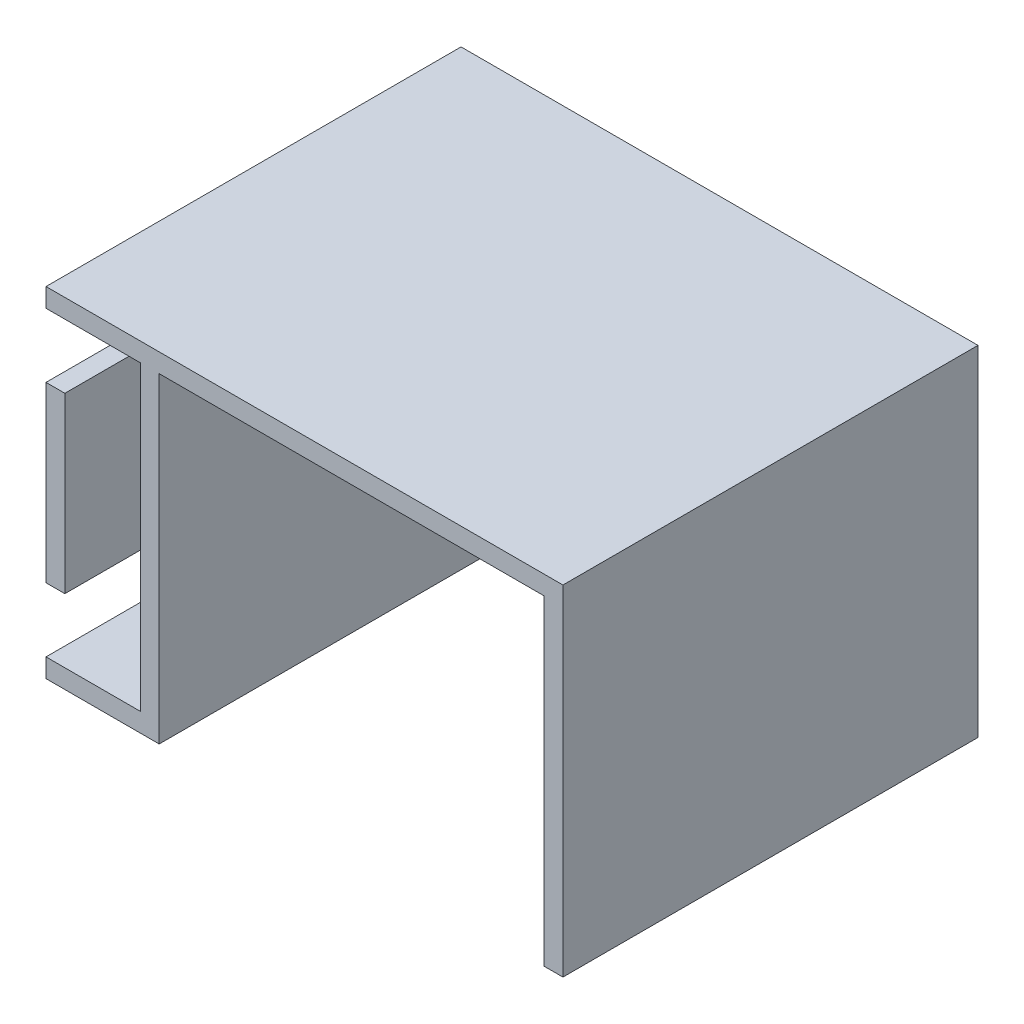
ISO-10303-21;
HEADER;
FILE_DESCRIPTION(('STEP AP214'),'2;1');
FILE_NAME('part.step','',(''),(''),'','','');
FILE_SCHEMA(('AUTOMOTIVE_DESIGN { 1 0 10303 214 1 1 1 1 }'));
ENDSEC;
DATA;
#1=APPLICATION_CONTEXT('core data for automotive mechanical design processes');
#2=APPLICATION_PROTOCOL_DEFINITION('international standard','automotive_design',2000,#1);
#3=PRODUCT_CONTEXT('',#1,'mechanical');
#4=PRODUCT('Part','Part','',(#3));
#5=PRODUCT_RELATED_PRODUCT_CATEGORY('part','',(#4));
#6=PRODUCT_DEFINITION_FORMATION('','',#4);
#7=PRODUCT_DEFINITION_CONTEXT('part definition',#1,'design');
#8=PRODUCT_DEFINITION('design','',#6,#7);
#9=PRODUCT_DEFINITION_SHAPE('','',#8);
#10=(LENGTH_UNIT() NAMED_UNIT(*) SI_UNIT(.MILLI.,.METRE.));
#11=(NAMED_UNIT(*) PLANE_ANGLE_UNIT() SI_UNIT($,.RADIAN.));
#12=(NAMED_UNIT(*) SI_UNIT($,.STERADIAN.) SOLID_ANGLE_UNIT());
#13=UNCERTAINTY_MEASURE_WITH_UNIT(LENGTH_MEASURE(1.E-05),#10,'distance_accuracy_value','');
#14=(GEOMETRIC_REPRESENTATION_CONTEXT(3) GLOBAL_UNCERTAINTY_ASSIGNED_CONTEXT((#13)) GLOBAL_UNIT_ASSIGNED_CONTEXT((#10,
#11,#12)) REPRESENTATION_CONTEXT('',''));
#15=CARTESIAN_POINT('',(0.,0.,0.));
#16=DIRECTION('',(0.,0.,1.));
#17=DIRECTION('',(1.,0.,0.));
#18=AXIS2_PLACEMENT_3D('',#15,#16,#17);
#19=CARTESIAN_POINT('',(0.,0.,22.));
#20=DIRECTION('',(0.,0.,-1.));
#21=DIRECTION('',(-1.,0.,0.));
#22=AXIS2_PLACEMENT_3D('',#19,#20,#21);
#23=PLANE('',#22);
#24=DIRECTION('',(0.,-1.,0.));
#25=VECTOR('',#24,1.);
#26=CARTESIAN_POINT('',(-16.2,10.1,22.));
#27=LINE('',#26,#25);
#28=CARTESIAN_POINT('',(-16.2,6.70000000000002,22.));
#29=VERTEX_POINT('',#28);
#30=CARTESIAN_POINT('',(-16.2,-2.5,22.));
#31=VERTEX_POINT('',#30);
#32=EDGE_CURVE('E236',#29,#31,#27,.T.);
#33=ORIENTED_EDGE('',*,*,#32,.T.);
#34=DIRECTION('',(-1.,0.,0.));
#35=VECTOR('',#34,1.);
#36=CARTESIAN_POINT('',(11.201,-2.5,22.));
#37=LINE('',#36,#35);
#38=CARTESIAN_POINT('',(-15.2,-2.5,22.));
#39=VERTEX_POINT('',#38);
#40=EDGE_CURVE('E165',#39,#31,#37,.T.);
#41=ORIENTED_EDGE('',*,*,#40,.F.);
#42=DIRECTION('',(0.,1.,0.));
#43=VECTOR('',#42,1.);
#44=CARTESIAN_POINT('',(-15.2,-5.89999999999999,22.));
#45=LINE('',#44,#43);
#46=CARTESIAN_POINT('',(-15.2,6.70000000000002,22.));
#47=VERTEX_POINT('',#46);
#48=EDGE_CURVE('E175',#39,#47,#45,.T.);
#49=ORIENTED_EDGE('',*,*,#48,.T.);
#50=DIRECTION('',(-1.,0.,0.));
#51=VECTOR('',#50,1.);
#52=CARTESIAN_POINT('',(11.201,6.70000000000002,22.));
#53=LINE('',#52,#51);
#54=EDGE_CURVE('E177',#47,#29,#53,.T.);
#55=ORIENTED_EDGE('',*,*,#54,.T.);
#56=EDGE_LOOP('',(#33,#41,#49,#55));
#57=FACE_BOUND('',#56,.T.);
#58=ADVANCED_FACE('F41',(#57),#23,.F.);
#59=CARTESIAN_POINT('',(-10.2,-6.9,22.));
#60=DIRECTION('',(-1.,0.,0.));
#61=DIRECTION('',(0.,-1.,0.));
#62=AXIS2_PLACEMENT_3D('',#59,#60,#61);
#63=PLANE('',#62);
#64=DIRECTION('',(0.,1.,0.));
#65=VECTOR('',#64,1.);
#66=CARTESIAN_POINT('',(-10.2,-6.9,0.));
#67=LINE('',#66,#65);
#68=CARTESIAN_POINT('',(-10.2,-6.9,0.));
#69=VERTEX_POINT('',#68);
#70=CARTESIAN_POINT('',(-10.2,10.1,0.));
#71=VERTEX_POINT('',#70);
#72=EDGE_CURVE('E201',#69,#71,#67,.T.);
#73=ORIENTED_EDGE('',*,*,#72,.T.);
#74=DIRECTION('',(0.,0.,-1.));
#75=VECTOR('',#74,1.);
#76=CARTESIAN_POINT('',(-10.2,10.1,22.));
#77=LINE('',#76,#75);
#78=CARTESIAN_POINT('',(-10.2,10.1,22.));
#79=VERTEX_POINT('',#78);
#80=EDGE_CURVE('E11',#79,#71,#77,.T.);
#81=ORIENTED_EDGE('',*,*,#80,.F.);
#82=DIRECTION('',(0.,1.,0.));
#83=VECTOR('',#82,1.);
#84=CARTESIAN_POINT('',(-10.2,-6.9,22.));
#85=LINE('',#84,#83);
#86=CARTESIAN_POINT('',(-10.2,-6.9,22.));
#87=VERTEX_POINT('',#86);
#88=EDGE_CURVE('E202',#87,#79,#85,.T.);
#89=ORIENTED_EDGE('',*,*,#88,.F.);
#90=DIRECTION('',(0.,0.,-1.));
#91=VECTOR('',#90,1.);
#92=CARTESIAN_POINT('',(-10.2,-6.9,22.));
#93=LINE('',#92,#91);
#94=EDGE_CURVE('E239',#87,#69,#93,.T.);
#95=ORIENTED_EDGE('',*,*,#94,.T.);
#96=EDGE_LOOP('',(#73,#81,#89,#95));
#97=FACE_BOUND('',#96,.T.);
#98=ADVANCED_FACE('F43',(#97),#63,.F.);
#99=CARTESIAN_POINT('',(-10.2,10.1,22.));
#100=DIRECTION('',(0.,1.,0.));
#101=DIRECTION('',(0.,0.,1.));
#102=AXIS2_PLACEMENT_3D('',#99,#100,#101);
#103=PLANE('',#102);
#104=DIRECTION('',(1.,0.,0.));
#105=VECTOR('',#104,1.);
#106=CARTESIAN_POINT('',(-10.2,10.1,0.));
#107=LINE('',#106,#105);
#108=CARTESIAN_POINT('',(10.2,10.1,0.));
#109=VERTEX_POINT('',#108);
#110=EDGE_CURVE('E243',#71,#109,#107,.T.);
#111=ORIENTED_EDGE('',*,*,#110,.T.);
#112=DIRECTION('',(0.,0.,-1.));
#113=VECTOR('',#112,1.);
#114=CARTESIAN_POINT('',(10.2,10.1,22.));
#115=LINE('',#114,#113);
#116=CARTESIAN_POINT('',(10.2,10.1,22.));
#117=VERTEX_POINT('',#116);
#118=EDGE_CURVE('E50',#117,#109,#115,.T.);
#119=ORIENTED_EDGE('',*,*,#118,.F.);
#120=DIRECTION('',(1.,0.,0.));
#121=VECTOR('',#120,1.);
#122=CARTESIAN_POINT('',(-10.2,10.1,22.));
#123=LINE('',#122,#121);
#124=EDGE_CURVE('E206',#79,#117,#123,.T.);
#125=ORIENTED_EDGE('',*,*,#124,.F.);
#126=ORIENTED_EDGE('',*,*,#80,.T.);
#127=EDGE_LOOP('',(#111,#119,#125,#126));
#128=FACE_BOUND('',#127,.T.);
#129=ADVANCED_FACE('F314',(#128),#103,.F.);
#130=CARTESIAN_POINT('',(10.2,10.1,22.));
#131=DIRECTION('',(1.,0.,0.));
#132=DIRECTION('',(0.,0.,-1.));
#133=AXIS2_PLACEMENT_3D('',#130,#131,#132);
#134=PLANE('',#133);
#135=DIRECTION('',(0.,-1.,0.));
#136=VECTOR('',#135,1.);
#137=CARTESIAN_POINT('',(10.2,10.1,0.));
#138=LINE('',#137,#136);
#139=CARTESIAN_POINT('',(10.2,-6.9,0.));
#140=VERTEX_POINT('',#139);
#141=EDGE_CURVE('E246',#109,#140,#138,.T.);
#142=ORIENTED_EDGE('',*,*,#141,.T.);
#143=DIRECTION('',(0.,0.,-1.));
#144=VECTOR('',#143,1.);
#145=CARTESIAN_POINT('',(10.2,-6.9,22.));
#146=LINE('',#145,#144);
#147=CARTESIAN_POINT('',(10.2,-6.9,22.));
#148=VERTEX_POINT('',#147);
#149=EDGE_CURVE('E282',#148,#140,#146,.T.);
#150=ORIENTED_EDGE('',*,*,#149,.F.);
#151=DIRECTION('',(0.,-1.,0.));
#152=VECTOR('',#151,1.);
#153=CARTESIAN_POINT('',(10.2,10.1,22.));
#154=LINE('',#153,#152);
#155=EDGE_CURVE('E210',#117,#148,#154,.T.);
#156=ORIENTED_EDGE('',*,*,#155,.F.);
#157=ORIENTED_EDGE('',*,*,#118,.T.);
#158=EDGE_LOOP('',(#142,#150,#156,#157));
#159=FACE_BOUND('',#158,.T.);
#160=ADVANCED_FACE('F291',(#159),#134,.F.);
#161=CARTESIAN_POINT('',(10.2,-6.9,22.));
#162=DIRECTION('',(0.,1.,0.));
#163=DIRECTION('',(-1.,0.,0.));
#164=AXIS2_PLACEMENT_3D('',#161,#162,#163);
#165=PLANE('',#164);
#166=DIRECTION('',(1.,0.,0.));
#167=VECTOR('',#166,1.);
#168=CARTESIAN_POINT('',(10.2,-6.9,0.));
#169=LINE('',#168,#167);
#170=CARTESIAN_POINT('',(11.2,-6.9,0.));
#171=VERTEX_POINT('',#170);
#172=EDGE_CURVE('E249',#140,#171,#169,.T.);
#173=ORIENTED_EDGE('',*,*,#172,.T.);
#174=DIRECTION('',(0.,0.,-1.));
#175=VECTOR('',#174,1.);
#176=CARTESIAN_POINT('',(11.2,-6.9,22.));
#177=LINE('',#176,#175);
#178=CARTESIAN_POINT('',(11.2,-6.9,22.));
#179=VERTEX_POINT('',#178);
#180=EDGE_CURVE('E278',#179,#171,#177,.T.);
#181=ORIENTED_EDGE('',*,*,#180,.F.);
#182=DIRECTION('',(1.,0.,0.));
#183=VECTOR('',#182,1.);
#184=CARTESIAN_POINT('',(10.2,-6.9,22.));
#185=LINE('',#184,#183);
#186=EDGE_CURVE('E213',#148,#179,#185,.T.);
#187=ORIENTED_EDGE('',*,*,#186,.F.);
#188=ORIENTED_EDGE('',*,*,#149,.T.);
#189=EDGE_LOOP('',(#173,#181,#187,#188));
#190=FACE_BOUND('',#189,.T.);
#191=ADVANCED_FACE('F302',(#190),#165,.F.);
#192=CARTESIAN_POINT('',(11.2,-6.9,22.));
#193=DIRECTION('',(-1.,0.,0.));
#194=DIRECTION('',(0.,-1.,0.));
#195=AXIS2_PLACEMENT_3D('',#192,#193,#194);
#196=PLANE('',#195);
#197=DIRECTION('',(0.,1.,0.));
#198=VECTOR('',#197,1.);
#199=CARTESIAN_POINT('',(11.2,-6.9,0.));
#200=LINE('',#199,#198);
#201=CARTESIAN_POINT('',(11.2,11.1,0.));
#202=VERTEX_POINT('',#201);
#203=EDGE_CURVE('E252',#171,#202,#200,.T.);
#204=ORIENTED_EDGE('',*,*,#203,.T.);
#205=DIRECTION('',(0.,0.,-1.));
#206=VECTOR('',#205,1.);
#207=CARTESIAN_POINT('',(11.2,11.1,22.));
#208=LINE('',#207,#206);
#209=CARTESIAN_POINT('',(11.2,11.1,22.));
#210=VERTEX_POINT('',#209);
#211=EDGE_CURVE('E274',#210,#202,#208,.T.);
#212=ORIENTED_EDGE('',*,*,#211,.F.);
#213=DIRECTION('',(0.,1.,0.));
#214=VECTOR('',#213,1.);
#215=CARTESIAN_POINT('',(11.2,-6.9,22.));
#216=LINE('',#215,#214);
#217=EDGE_CURVE('E216',#179,#210,#216,.T.);
#218=ORIENTED_EDGE('',*,*,#217,.F.);
#219=ORIENTED_EDGE('',*,*,#180,.T.);
#220=EDGE_LOOP('',(#204,#212,#218,#219));
#221=FACE_BOUND('',#220,.T.);
#222=ADVANCED_FACE('F306',(#221),#196,.F.);
#223=CARTESIAN_POINT('',(11.2,11.1,22.));
#224=DIRECTION('',(0.,-1.,0.));
#225=DIRECTION('',(1.,0.,0.));
#226=AXIS2_PLACEMENT_3D('',#223,#224,#225);
#227=PLANE('',#226);
#228=DIRECTION('',(-1.,0.,0.));
#229=VECTOR('',#228,1.);
#230=CARTESIAN_POINT('',(11.2,11.1,0.));
#231=LINE('',#230,#229);
#232=CARTESIAN_POINT('',(-16.2,11.1,0.));
#233=VERTEX_POINT('',#232);
#234=EDGE_CURVE('E255',#202,#233,#231,.T.);
#235=ORIENTED_EDGE('',*,*,#234,.T.);
#236=DIRECTION('',(0.,0.,1.));
#237=VECTOR('',#236,1.);
#238=CARTESIAN_POINT('',(-16.2,11.1,-5.09901951359278));
#239=LINE('',#238,#237);
#240=CARTESIAN_POINT('',(-16.2,11.1,22.));
#241=VERTEX_POINT('',#240);
#242=EDGE_CURVE('E192',#233,#241,#239,.T.);
#243=ORIENTED_EDGE('',*,*,#242,.T.);
#244=DIRECTION('',(-1.,0.,0.));
#245=VECTOR('',#244,1.);
#246=CARTESIAN_POINT('',(11.2,11.1,22.));
#247=LINE('',#246,#245);
#248=EDGE_CURVE('E219',#210,#241,#247,.T.);
#249=ORIENTED_EDGE('',*,*,#248,.F.);
#250=ORIENTED_EDGE('',*,*,#211,.T.);
#251=EDGE_LOOP('',(#235,#243,#249,#250));
#252=FACE_BOUND('',#251,.T.);
#253=ADVANCED_FACE('F401',(#252),#227,.F.);
#254=CARTESIAN_POINT('',(-11.2,11.1,22.));
#255=DIRECTION('',(1.,0.,0.));
#256=DIRECTION('',(0.,0.,-1.));
#257=AXIS2_PLACEMENT_3D('',#254,#255,#256);
#258=PLANE('',#257);
#259=DIRECTION('',(0.,-1.,0.));
#260=VECTOR('',#259,1.);
#261=CARTESIAN_POINT('',(-11.2,11.1,22.));
#262=LINE('',#261,#260);
#263=CARTESIAN_POINT('',(-11.2,10.1,22.));
#264=VERTEX_POINT('',#263);
#265=CARTESIAN_POINT('',(-11.2,-5.89999999999999,22.));
#266=VERTEX_POINT('',#265);
#267=EDGE_CURVE('E57',#264,#266,#262,.T.);
#268=ORIENTED_EDGE('',*,*,#267,.F.);
#269=DIRECTION('',(0.,0.,1.));
#270=VECTOR('',#269,1.);
#271=CARTESIAN_POINT('',(-11.2,10.1,-5.09901951359278));
#272=LINE('',#271,#270);
#273=CARTESIAN_POINT('',(-11.2,10.1,0.999999999999998));
#274=VERTEX_POINT('',#273);
#275=EDGE_CURVE('E185',#274,#264,#272,.T.);
#276=ORIENTED_EDGE('',*,*,#275,.F.);
#277=DIRECTION('',(0.,-1.,0.));
#278=VECTOR('',#277,1.);
#279=CARTESIAN_POINT('',(-11.2,10.1,1.));
#280=LINE('',#279,#278);
#281=CARTESIAN_POINT('',(-11.2,-5.89999999999999,1.));
#282=VERTEX_POINT('',#281);
#283=EDGE_CURVE('E62',#274,#282,#280,.T.);
#284=ORIENTED_EDGE('',*,*,#283,.T.);
#285=DIRECTION('',(0.,0.,-1.));
#286=VECTOR('',#285,1.);
#287=CARTESIAN_POINT('',(-11.2,-5.89999999999999,22.));
#288=LINE('',#287,#286);
#289=EDGE_CURVE('E271',#266,#282,#288,.T.);
#290=ORIENTED_EDGE('',*,*,#289,.F.);
#291=EDGE_LOOP('',(#268,#276,#284,#290));
#292=FACE_BOUND('',#291,.T.);
#293=ADVANCED_FACE('F367',(#292),#258,.F.);
#294=CARTESIAN_POINT('',(-11.2,-5.89999999999999,22.));
#295=DIRECTION('',(0.,-1.,0.));
#296=DIRECTION('',(1.,0.,0.));
#297=AXIS2_PLACEMENT_3D('',#294,#295,#296);
#298=PLANE('',#297);
#299=ORIENTED_EDGE('',*,*,#289,.T.);
#300=DIRECTION('',(-1.,0.,0.));
#301=VECTOR('',#300,1.);
#302=CARTESIAN_POINT('',(-15.2,-5.89999999999999,1.));
#303=LINE('',#302,#301);
#304=CARTESIAN_POINT('',(-16.2,-5.89999999999999,1.));
#305=VERTEX_POINT('',#304);
#306=EDGE_CURVE('E198',#282,#305,#303,.T.);
#307=ORIENTED_EDGE('',*,*,#306,.T.);
#308=DIRECTION('',(0.,0.,1.));
#309=VECTOR('',#308,1.);
#310=CARTESIAN_POINT('',(-16.2,-5.89999999999999,1.));
#311=LINE('',#310,#309);
#312=CARTESIAN_POINT('',(-16.2,-5.89999999999999,22.));
#313=VERTEX_POINT('',#312);
#314=EDGE_CURVE('E166',#305,#313,#311,.T.);
#315=ORIENTED_EDGE('',*,*,#314,.T.);
#316=DIRECTION('',(-1.,0.,0.));
#317=VECTOR('',#316,1.);
#318=CARTESIAN_POINT('',(-11.2,-5.89999999999999,22.));
#319=LINE('',#318,#317);
#320=EDGE_CURVE('E225',#266,#313,#319,.T.);
#321=ORIENTED_EDGE('',*,*,#320,.F.);
#322=EDGE_LOOP('',(#299,#307,#315,#321));
#323=FACE_BOUND('',#322,.T.);
#324=ADVANCED_FACE('F363',(#323),#298,.F.);
#325=CARTESIAN_POINT('',(-15.2,-5.89999999999999,22.));
#326=DIRECTION('',(-1.,0.,0.));
#327=DIRECTION('',(0.,-1.,0.));
#328=AXIS2_PLACEMENT_3D('',#325,#326,#327);
#329=PLANE('',#328);
#330=ORIENTED_EDGE('',*,*,#48,.F.);
#331=DIRECTION('',(0.,0.,1.));
#332=VECTOR('',#331,1.);
#333=CARTESIAN_POINT('',(-15.2,-2.5,1.));
#334=LINE('',#333,#332);
#335=CARTESIAN_POINT('',(-15.2,-2.5,1.));
#336=VERTEX_POINT('',#335);
#337=EDGE_CURVE('E156',#336,#39,#334,.T.);
#338=ORIENTED_EDGE('',*,*,#337,.F.);
#339=DIRECTION('',(0.,1.,0.));
#340=VECTOR('',#339,1.);
#341=CARTESIAN_POINT('',(-15.2,10.1,1.));
#342=LINE('',#341,#340);
#343=CARTESIAN_POINT('',(-15.2,6.70000000000001,1.));
#344=VERTEX_POINT('',#343);
#345=EDGE_CURVE('E173',#336,#344,#342,.T.);
#346=ORIENTED_EDGE('',*,*,#345,.T.);
#347=DIRECTION('',(0.,0.,-1.));
#348=VECTOR('',#347,1.);
#349=CARTESIAN_POINT('',(-15.2,6.70000000000002,22.));
#350=LINE('',#349,#348);
#351=EDGE_CURVE('E342',#47,#344,#350,.T.);
#352=ORIENTED_EDGE('',*,*,#351,.F.);
#353=EDGE_LOOP('',(#330,#338,#346,#352));
#354=FACE_BOUND('',#353,.T.);
#355=ADVANCED_FACE('F171',(#354),#329,.F.);
#356=CARTESIAN_POINT('',(-16.2,10.1,22.));
#357=DIRECTION('',(1.,0.,0.));
#358=DIRECTION('',(0.,0.,-1.));
#359=AXIS2_PLACEMENT_3D('',#356,#357,#358);
#360=PLANE('',#359);
#361=DIRECTION('',(0.,-1.,0.));
#362=VECTOR('',#361,1.);
#363=CARTESIAN_POINT('',(-16.2,-5.89999999999999,1.));
#364=LINE('',#363,#362);
#365=CARTESIAN_POINT('',(-16.2,-2.5,1.));
#366=VERTEX_POINT('',#365);
#367=EDGE_CURVE('E356',#366,#305,#364,.T.);
#368=ORIENTED_EDGE('',*,*,#367,.F.);
#369=DIRECTION('',(0.,0.,-1.));
#370=VECTOR('',#369,1.);
#371=CARTESIAN_POINT('',(-16.2,-2.5,1.));
#372=LINE('',#371,#370);
#373=EDGE_CURVE('E159',#31,#366,#372,.T.);
#374=ORIENTED_EDGE('',*,*,#373,.F.);
#375=ORIENTED_EDGE('',*,*,#32,.F.);
#376=DIRECTION('',(0.,0.,1.));
#377=VECTOR('',#376,1.);
#378=CARTESIAN_POINT('',(-16.2,6.70000000000002,22.));
#379=LINE('',#378,#377);
#380=CARTESIAN_POINT('',(-16.2,6.70000000000001,1.));
#381=VERTEX_POINT('',#380);
#382=EDGE_CURVE('E338',#381,#29,#379,.T.);
#383=ORIENTED_EDGE('',*,*,#382,.F.);
#384=DIRECTION('',(0.,-1.,0.));
#385=VECTOR('',#384,1.);
#386=CARTESIAN_POINT('',(-16.2,10.1,1.));
#387=LINE('',#386,#385);
#388=CARTESIAN_POINT('',(-16.2,10.1,1.));
#389=VERTEX_POINT('',#388);
#390=EDGE_CURVE('E349',#389,#381,#387,.T.);
#391=ORIENTED_EDGE('',*,*,#390,.F.);
#392=DIRECTION('',(0.,0.,-1.));
#393=VECTOR('',#392,1.);
#394=CARTESIAN_POINT('',(-16.2,10.1,22.));
#395=LINE('',#394,#393);
#396=CARTESIAN_POINT('',(-16.2,10.1,22.));
#397=VERTEX_POINT('',#396);
#398=EDGE_CURVE('E345',#397,#389,#395,.T.);
#399=ORIENTED_EDGE('',*,*,#398,.F.);
#400=EDGE_CURVE('E231',#241,#397,#27,.T.);
#401=ORIENTED_EDGE('',*,*,#400,.F.);
#402=ORIENTED_EDGE('',*,*,#242,.F.);
#403=DIRECTION('',(0.,-1.,0.));
#404=VECTOR('',#403,1.);
#405=CARTESIAN_POINT('',(-16.2,10.1,0.));
#406=LINE('',#405,#404);
#407=CARTESIAN_POINT('',(-16.2,-6.9,0.));
#408=VERTEX_POINT('',#407);
#409=EDGE_CURVE('E259',#233,#408,#406,.T.);
#410=ORIENTED_EDGE('',*,*,#409,.T.);
#411=DIRECTION('',(0.,0.,-1.));
#412=VECTOR('',#411,1.);
#413=CARTESIAN_POINT('',(-16.2,-6.9,22.));
#414=LINE('',#413,#412);
#415=CARTESIAN_POINT('',(-16.2,-6.9,22.));
#416=VERTEX_POINT('',#415);
#417=EDGE_CURVE('E267',#416,#408,#414,.T.);
#418=ORIENTED_EDGE('',*,*,#417,.F.);
#419=EDGE_CURVE('E230',#313,#416,#27,.T.);
#420=ORIENTED_EDGE('',*,*,#419,.F.);
#421=ORIENTED_EDGE('',*,*,#314,.F.);
#422=EDGE_LOOP('',(#368,#374,#375,#383,#391,#399,#401,#402,#410,#418,#420,#421));
#423=FACE_BOUND('',#422,.T.);
#424=ADVANCED_FACE('F324',(#423),#360,.F.);
#425=CARTESIAN_POINT('',(-10.2,-6.9,22.));
#426=DIRECTION('',(0.,1.,0.));
#427=DIRECTION('',(-1.,0.,0.));
#428=AXIS2_PLACEMENT_3D('',#425,#426,#427);
#429=PLANE('',#428);
#430=DIRECTION('',(1.,0.,0.));
#431=VECTOR('',#430,1.);
#432=CARTESIAN_POINT('',(-10.2,-6.9,0.));
#433=LINE('',#432,#431);
#434=EDGE_CURVE('E207',#408,#69,#433,.T.);
#435=ORIENTED_EDGE('',*,*,#434,.T.);
#436=ORIENTED_EDGE('',*,*,#94,.F.);
#437=DIRECTION('',(1.,0.,0.));
#438=VECTOR('',#437,1.);
#439=CARTESIAN_POINT('',(-10.2,-6.9,22.));
#440=LINE('',#439,#438);
#441=EDGE_CURVE('E235',#416,#87,#440,.T.);
#442=ORIENTED_EDGE('',*,*,#441,.F.);
#443=ORIENTED_EDGE('',*,*,#417,.T.);
#444=EDGE_LOOP('',(#435,#436,#442,#443));
#445=FACE_BOUND('',#444,.T.);
#446=ADVANCED_FACE('F319',(#445),#429,.F.);
#447=ORIENTED_EDGE('',*,*,#320,.T.);
#448=ORIENTED_EDGE('',*,*,#419,.T.);
#449=ORIENTED_EDGE('',*,*,#441,.T.);
#450=ORIENTED_EDGE('',*,*,#88,.T.);
#451=ORIENTED_EDGE('',*,*,#124,.T.);
#452=ORIENTED_EDGE('',*,*,#155,.T.);
#453=ORIENTED_EDGE('',*,*,#186,.T.);
#454=ORIENTED_EDGE('',*,*,#217,.T.);
#455=ORIENTED_EDGE('',*,*,#248,.T.);
#456=ORIENTED_EDGE('',*,*,#400,.T.);
#457=DIRECTION('',(1.,0.,0.));
#458=VECTOR('',#457,1.);
#459=CARTESIAN_POINT('',(-11.2,10.1,22.));
#460=LINE('',#459,#458);
#461=EDGE_CURVE('E330',#397,#264,#460,.T.);
#462=ORIENTED_EDGE('',*,*,#461,.T.);
#463=ORIENTED_EDGE('',*,*,#267,.T.);
#464=EDGE_LOOP('',(#447,#448,#449,#450,#451,#452,#453,#454,#455,#456,#462,#463));
#465=FACE_BOUND('',#464,.T.);
#466=ADVANCED_FACE('F310',(#465),#23,.F.);
#467=CARTESIAN_POINT('',(0.,0.,0.));
#468=DIRECTION('',(0.,0.,-1.));
#469=DIRECTION('',(-1.,0.,0.));
#470=AXIS2_PLACEMENT_3D('',#467,#468,#469);
#471=PLANE('',#470);
#472=ORIENTED_EDGE('',*,*,#409,.F.);
#473=ORIENTED_EDGE('',*,*,#234,.F.);
#474=ORIENTED_EDGE('',*,*,#203,.F.);
#475=ORIENTED_EDGE('',*,*,#172,.F.);
#476=ORIENTED_EDGE('',*,*,#141,.F.);
#477=ORIENTED_EDGE('',*,*,#110,.F.);
#478=ORIENTED_EDGE('',*,*,#72,.F.);
#479=ORIENTED_EDGE('',*,*,#434,.F.);
#480=EDGE_LOOP('',(#472,#473,#474,#475,#476,#477,#478,#479));
#481=FACE_BOUND('',#480,.T.);
#482=ADVANCED_FACE('F296',(#481),#471,.T.);
#483=CARTESIAN_POINT('',(0.,0.,1.));
#484=DIRECTION('',(0.,0.,1.));
#485=DIRECTION('',(1.,0.,0.));
#486=AXIS2_PLACEMENT_3D('',#483,#484,#485);
#487=PLANE('',#486);
#488=ORIENTED_EDGE('',*,*,#345,.F.);
#489=DIRECTION('',(-1.,0.,0.));
#490=VECTOR('',#489,1.);
#491=CARTESIAN_POINT('',(11.201,-2.5,1.));
#492=LINE('',#491,#490);
#493=EDGE_CURVE('E153',#336,#366,#492,.T.);
#494=ORIENTED_EDGE('',*,*,#493,.T.);
#495=ORIENTED_EDGE('',*,*,#367,.T.);
#496=ORIENTED_EDGE('',*,*,#306,.F.);
#497=ORIENTED_EDGE('',*,*,#283,.F.);
#498=DIRECTION('',(1.,0.,0.));
#499=VECTOR('',#498,1.);
#500=CARTESIAN_POINT('',(-15.2,10.1,1.));
#501=LINE('',#500,#499);
#502=EDGE_CURVE('E184',#389,#274,#501,.T.);
#503=ORIENTED_EDGE('',*,*,#502,.F.);
#504=ORIENTED_EDGE('',*,*,#390,.T.);
#505=DIRECTION('',(-1.,0.,0.));
#506=VECTOR('',#505,1.);
#507=CARTESIAN_POINT('',(11.201,6.70000000000002,1.));
#508=LINE('',#507,#506);
#509=EDGE_CURVE('E181',#344,#381,#508,.T.);
#510=ORIENTED_EDGE('',*,*,#509,.F.);
#511=EDGE_LOOP('',(#488,#494,#495,#496,#497,#503,#504,#510));
#512=FACE_BOUND('',#511,.T.);
#513=ADVANCED_FACE('F179',(#512),#487,.T.);
#514=CARTESIAN_POINT('',(-11.2,10.1,-5.09901951359278));
#515=DIRECTION('',(0.,-1.,0.));
#516=DIRECTION('',(0.,0.,-1.));
#517=AXIS2_PLACEMENT_3D('',#514,#515,#516);
#518=PLANE('',#517);
#519=ORIENTED_EDGE('',*,*,#461,.F.);
#520=ORIENTED_EDGE('',*,*,#398,.T.);
#521=ORIENTED_EDGE('',*,*,#502,.T.);
#522=ORIENTED_EDGE('',*,*,#275,.T.);
#523=EDGE_LOOP('',(#519,#520,#521,#522));
#524=FACE_BOUND('',#523,.T.);
#525=ADVANCED_FACE('F369',(#524),#518,.T.);
#526=CARTESIAN_POINT('',(11.201,6.70000000000002,22.));
#527=DIRECTION('',(0.,-1.,0.));
#528=DIRECTION('',(0.,0.,-1.));
#529=AXIS2_PLACEMENT_3D('',#526,#527,#528);
#530=PLANE('',#529);
#531=ORIENTED_EDGE('',*,*,#351,.T.);
#532=ORIENTED_EDGE('',*,*,#509,.T.);
#533=ORIENTED_EDGE('',*,*,#382,.T.);
#534=ORIENTED_EDGE('',*,*,#54,.F.);
#535=EDGE_LOOP('',(#531,#532,#533,#534));
#536=FACE_BOUND('',#535,.T.);
#537=ADVANCED_FACE('F373',(#536),#530,.F.);
#538=CARTESIAN_POINT('',(11.201,-2.5,1.));
#539=DIRECTION('',(0.,1.,0.));
#540=DIRECTION('',(-1.,0.,0.));
#541=AXIS2_PLACEMENT_3D('',#538,#539,#540);
#542=PLANE('',#541);
#543=ORIENTED_EDGE('',*,*,#337,.T.);
#544=ORIENTED_EDGE('',*,*,#40,.T.);
#545=ORIENTED_EDGE('',*,*,#373,.T.);
#546=ORIENTED_EDGE('',*,*,#493,.F.);
#547=EDGE_LOOP('',(#543,#544,#545,#546));
#548=FACE_BOUND('',#547,.T.);
#549=ADVANCED_FACE('F155',(#548),#542,.F.);
#550=CLOSED_SHELL('',(#58,#98,#129,#160,#191,#222,#253,#293,#324,#355,#424,#446,#466,#482,#513,
#525,#537,#549));
#551=MANIFOLD_SOLID_BREP('B2',#550);
#552=ADVANCED_BREP_SHAPE_REPRESENTATION('',(#18,#551),#14);
#553=SHAPE_DEFINITION_REPRESENTATION(#9,#552);
ENDSEC;
END-ISO-10303-21;
